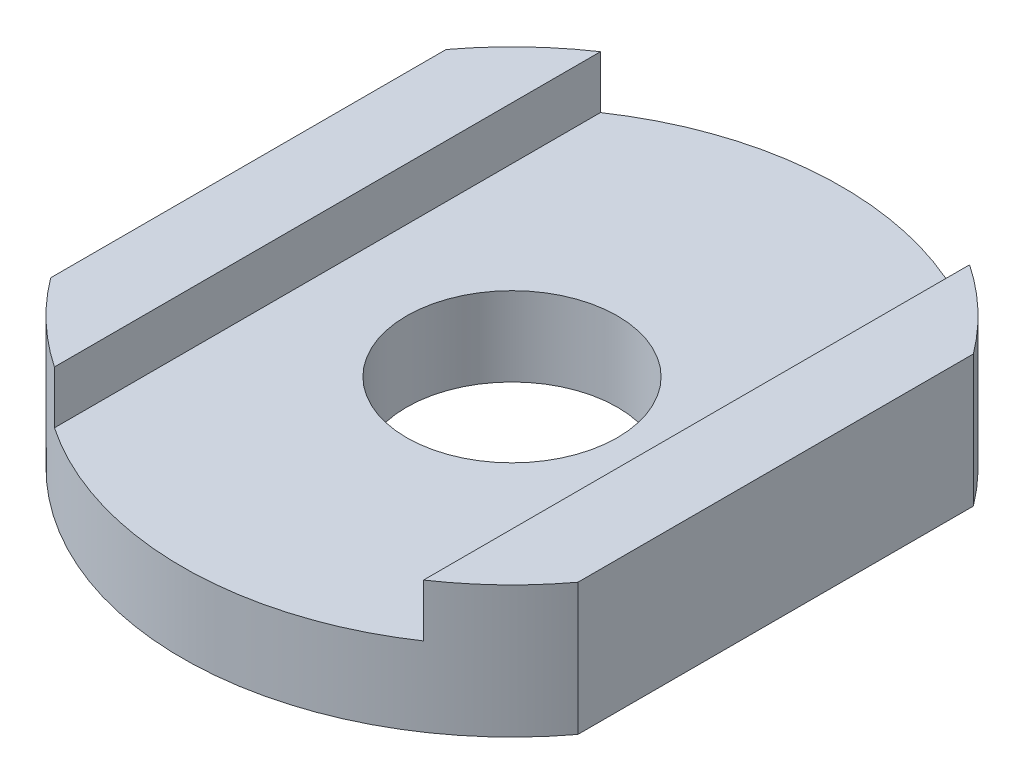
ISO-10303-21;
HEADER;
FILE_DESCRIPTION(('STEP AP214'),'2;1');
FILE_NAME('part.step','',(''),(''),'','','');
FILE_SCHEMA(('AUTOMOTIVE_DESIGN { 1 0 10303 214 1 1 1 1 }'));
ENDSEC;
DATA;
#1=APPLICATION_CONTEXT('core data for automotive mechanical design processes');
#2=APPLICATION_PROTOCOL_DEFINITION('international standard','automotive_design',2000,#1);
#3=PRODUCT_CONTEXT('',#1,'mechanical');
#4=PRODUCT('Part','Part','',(#3));
#5=PRODUCT_RELATED_PRODUCT_CATEGORY('part','',(#4));
#6=PRODUCT_DEFINITION_FORMATION('','',#4);
#7=PRODUCT_DEFINITION_CONTEXT('part definition',#1,'design');
#8=PRODUCT_DEFINITION('design','',#6,#7);
#9=PRODUCT_DEFINITION_SHAPE('','',#8);
#10=(LENGTH_UNIT() NAMED_UNIT(*) SI_UNIT(.MILLI.,.METRE.));
#11=(NAMED_UNIT(*) PLANE_ANGLE_UNIT() SI_UNIT($,.RADIAN.));
#12=(NAMED_UNIT(*) SI_UNIT($,.STERADIAN.) SOLID_ANGLE_UNIT());
#13=UNCERTAINTY_MEASURE_WITH_UNIT(LENGTH_MEASURE(1.E-05),#10,'distance_accuracy_value','');
#14=(GEOMETRIC_REPRESENTATION_CONTEXT(3) GLOBAL_UNCERTAINTY_ASSIGNED_CONTEXT((#13)) GLOBAL_UNIT_ASSIGNED_CONTEXT((#10,
#11,#12)) REPRESENTATION_CONTEXT('',''));
#15=CARTESIAN_POINT('',(0.,0.,0.));
#16=DIRECTION('',(0.,0.,1.));
#17=DIRECTION('',(1.,0.,0.));
#18=AXIS2_PLACEMENT_3D('',#15,#16,#17);
#19=CARTESIAN_POINT('',(0.,3.,0.));
#20=DIRECTION('',(0.,1.,0.));
#21=DIRECTION('',(0.,0.,1.));
#22=AXIS2_PLACEMENT_3D('',#19,#20,#21);
#23=PLANE('',#22);
#24=CARTESIAN_POINT('',(0.,3.,0.));
#25=DIRECTION('',(0.,1.,0.));
#26=DIRECTION('',(0.,0.,1.));
#27=AXIS2_PLACEMENT_3D('',#24,#25,#26);
#28=CIRCLE('',#27,4.);
#29=CARTESIAN_POINT('',(0.,3.,4.));
#30=VERTEX_POINT('',#29);
#31=EDGE_CURVE('E148',#30,#30,#28,.T.);
#32=ORIENTED_EDGE('',*,*,#31,.F.);
#33=EDGE_LOOP('',(#32));
#34=FACE_BOUND('',#33,.T.);
#35=DIRECTION('',(0.,0.,-1.));
#36=VECTOR('',#35,1.);
#37=CARTESIAN_POINT('',(-7.,3.,0.));
#38=LINE('',#37,#36);
#39=CARTESIAN_POINT('',(-7.,3.,10.356157588604));
#40=VERTEX_POINT('',#39);
#41=CARTESIAN_POINT('',(-7.,3.,-10.356157588604));
#42=VERTEX_POINT('',#41);
#43=EDGE_CURVE('E11',#40,#42,#38,.T.);
#44=ORIENTED_EDGE('',*,*,#43,.F.);
#45=CARTESIAN_POINT('',(0.,3.,0.));
#46=DIRECTION('',(0.,1.,0.));
#47=DIRECTION('',(0.,0.,1.));
#48=AXIS2_PLACEMENT_3D('',#45,#46,#47);
#49=CIRCLE('',#48,12.5);
#50=CARTESIAN_POINT('',(7.,3.,10.356157588604));
#51=VERTEX_POINT('',#50);
#52=EDGE_CURVE('E151',#40,#51,#49,.T.);
#53=ORIENTED_EDGE('',*,*,#52,.T.);
#54=DIRECTION('',(0.,0.,-1.));
#55=VECTOR('',#54,1.);
#56=CARTESIAN_POINT('',(7.,3.,0.));
#57=LINE('',#56,#55);
#58=CARTESIAN_POINT('',(7.,3.,-10.356157588604));
#59=VERTEX_POINT('',#58);
#60=EDGE_CURVE('E47',#51,#59,#57,.T.);
#61=ORIENTED_EDGE('',*,*,#60,.T.);
#62=CARTESIAN_POINT('',(0.,3.,0.));
#63=DIRECTION('',(0.,1.,0.));
#64=DIRECTION('',(0.,0.,1.));
#65=AXIS2_PLACEMENT_3D('',#62,#63,#64);
#66=CIRCLE('',#65,12.5);
#67=EDGE_CURVE('E157',#59,#42,#66,.T.);
#68=ORIENTED_EDGE('',*,*,#67,.T.);
#69=EDGE_LOOP('',(#44,#53,#61,#68));
#70=FACE_BOUND('',#69,.T.);
#71=ADVANCED_FACE('F41',(#34,#70),#23,.T.);
#72=CARTESIAN_POINT('',(0.,3.,0.));
#73=DIRECTION('',(0.,-1.,0.));
#74=DIRECTION('',(0.,0.,-1.));
#75=AXIS2_PLACEMENT_3D('',#72,#73,#74);
#76=CYLINDRICAL_SURFACE('',#75,12.5);
#77=DIRECTION('',(0.,-1.,0.));
#78=VECTOR('',#77,1.);
#79=CARTESIAN_POINT('',(10.,3.,7.5));
#80=LINE('',#79,#78);
#81=CARTESIAN_POINT('',(10.,5.,7.5));
#82=VERTEX_POINT('',#81);
#83=CARTESIAN_POINT('',(10.,0.,7.5));
#84=VERTEX_POINT('',#83);
#85=EDGE_CURVE('E174',#82,#84,#80,.T.);
#86=ORIENTED_EDGE('',*,*,#85,.F.);
#87=CARTESIAN_POINT('',(0.,5.,0.));
#88=DIRECTION('',(0.,1.,0.));
#89=DIRECTION('',(0.,0.,1.));
#90=AXIS2_PLACEMENT_3D('',#87,#88,#89);
#91=CIRCLE('',#90,12.5);
#92=CARTESIAN_POINT('',(7.,5.,10.356157588604));
#93=VERTEX_POINT('',#92);
#94=EDGE_CURVE('E144',#93,#82,#91,.T.);
#95=ORIENTED_EDGE('',*,*,#94,.F.);
#96=DIRECTION('',(0.,-1.,0.));
#97=VECTOR('',#96,1.);
#98=CARTESIAN_POINT('',(7.,5.,10.356157588604));
#99=LINE('',#98,#97);
#100=EDGE_CURVE('E135',#93,#51,#99,.T.);
#101=ORIENTED_EDGE('',*,*,#100,.T.);
#102=ORIENTED_EDGE('',*,*,#52,.F.);
#103=DIRECTION('',(0.,-1.,0.));
#104=VECTOR('',#103,1.);
#105=CARTESIAN_POINT('',(-7.,5.,10.356157588604));
#106=LINE('',#105,#104);
#107=CARTESIAN_POINT('',(-7.,5.,10.356157588604));
#108=VERTEX_POINT('',#107);
#109=EDGE_CURVE('E113',#108,#40,#106,.T.);
#110=ORIENTED_EDGE('',*,*,#109,.F.);
#111=CARTESIAN_POINT('',(0.,5.,0.));
#112=DIRECTION('',(0.,1.,0.));
#113=DIRECTION('',(0.,0.,1.));
#114=AXIS2_PLACEMENT_3D('',#111,#112,#113);
#115=CIRCLE('',#114,12.5);
#116=CARTESIAN_POINT('',(-10.,5.,7.5));
#117=VERTEX_POINT('',#116);
#118=EDGE_CURVE('E129',#117,#108,#115,.T.);
#119=ORIENTED_EDGE('',*,*,#118,.F.);
#120=DIRECTION('',(0.,-1.,0.));
#121=VECTOR('',#120,1.);
#122=CARTESIAN_POINT('',(-10.,3.,7.5));
#123=LINE('',#122,#121);
#124=CARTESIAN_POINT('',(-10.,0.,7.5));
#125=VERTEX_POINT('',#124);
#126=EDGE_CURVE('E156',#117,#125,#123,.T.);
#127=ORIENTED_EDGE('',*,*,#126,.T.);
#128=CARTESIAN_POINT('',(0.,0.,0.));
#129=DIRECTION('',(0.,1.,0.));
#130=DIRECTION('',(0.,0.,1.));
#131=AXIS2_PLACEMENT_3D('',#128,#129,#130);
#132=CIRCLE('',#131,12.5);
#133=EDGE_CURVE('E163',#125,#84,#132,.T.);
#134=ORIENTED_EDGE('',*,*,#133,.T.);
#135=EDGE_LOOP('',(#86,#95,#101,#102,#110,#119,#127,#134));
#136=FACE_BOUND('',#135,.T.);
#137=ADVANCED_FACE('F193',(#136),#76,.T.);
#138=CARTESIAN_POINT('',(10.,3.,0.));
#139=DIRECTION('',(-1.,0.,0.));
#140=DIRECTION('',(0.,0.,1.));
#141=AXIS2_PLACEMENT_3D('',#138,#139,#140);
#142=PLANE('',#141);
#143=DIRECTION('',(0.,0.,-1.));
#144=VECTOR('',#143,1.);
#145=CARTESIAN_POINT('',(10.,0.,0.));
#146=LINE('',#145,#144);
#147=CARTESIAN_POINT('',(10.,0.,-7.5));
#148=VERTEX_POINT('',#147);
#149=EDGE_CURVE('E161',#84,#148,#146,.T.);
#150=ORIENTED_EDGE('',*,*,#149,.T.);
#151=DIRECTION('',(0.,-1.,0.));
#152=VECTOR('',#151,1.);
#153=CARTESIAN_POINT('',(10.,3.,-7.5));
#154=LINE('',#153,#152);
#155=CARTESIAN_POINT('',(10.,5.,-7.5));
#156=VERTEX_POINT('',#155);
#157=EDGE_CURVE('E173',#156,#148,#154,.T.);
#158=ORIENTED_EDGE('',*,*,#157,.F.);
#159=DIRECTION('',(0.,0.,-1.));
#160=VECTOR('',#159,1.);
#161=CARTESIAN_POINT('',(10.,5.,0.));
#162=LINE('',#161,#160);
#163=EDGE_CURVE('E138',#82,#156,#162,.T.);
#164=ORIENTED_EDGE('',*,*,#163,.F.);
#165=ORIENTED_EDGE('',*,*,#85,.T.);
#166=EDGE_LOOP('',(#150,#158,#164,#165));
#167=FACE_BOUND('',#166,.T.);
#168=ADVANCED_FACE('F182',(#167),#142,.F.);
#169=CARTESIAN_POINT('',(0.,3.,0.));
#170=DIRECTION('',(0.,-1.,0.));
#171=DIRECTION('',(0.,0.,-1.));
#172=AXIS2_PLACEMENT_3D('',#169,#170,#171);
#173=CYLINDRICAL_SURFACE('',#172,12.5);
#174=DIRECTION('',(0.,-1.,0.));
#175=VECTOR('',#174,1.);
#176=CARTESIAN_POINT('',(-10.,3.,-7.5));
#177=LINE('',#176,#175);
#178=CARTESIAN_POINT('',(-10.,5.,-7.5));
#179=VERTEX_POINT('',#178);
#180=CARTESIAN_POINT('',(-10.,0.,-7.5));
#181=VERTEX_POINT('',#180);
#182=EDGE_CURVE('E123',#179,#181,#177,.T.);
#183=ORIENTED_EDGE('',*,*,#182,.F.);
#184=CARTESIAN_POINT('',(0.,5.,0.));
#185=DIRECTION('',(0.,1.,0.));
#186=DIRECTION('',(0.,0.,1.));
#187=AXIS2_PLACEMENT_3D('',#184,#185,#186);
#188=CIRCLE('',#187,12.5);
#189=CARTESIAN_POINT('',(-7.,5.,-10.356157588604));
#190=VERTEX_POINT('',#189);
#191=EDGE_CURVE('E116',#190,#179,#188,.T.);
#192=ORIENTED_EDGE('',*,*,#191,.F.);
#193=DIRECTION('',(0.,-1.,0.));
#194=VECTOR('',#193,1.);
#195=CARTESIAN_POINT('',(-7.,5.,-10.356157588604));
#196=LINE('',#195,#194);
#197=EDGE_CURVE('E108',#190,#42,#196,.T.);
#198=ORIENTED_EDGE('',*,*,#197,.T.);
#199=ORIENTED_EDGE('',*,*,#67,.F.);
#200=DIRECTION('',(0.,-1.,0.));
#201=VECTOR('',#200,1.);
#202=CARTESIAN_POINT('',(7.,5.,-10.356157588604));
#203=LINE('',#202,#201);
#204=CARTESIAN_POINT('',(7.,5.,-10.356157588604));
#205=VERTEX_POINT('',#204);
#206=EDGE_CURVE('E57',#205,#59,#203,.T.);
#207=ORIENTED_EDGE('',*,*,#206,.F.);
#208=CARTESIAN_POINT('',(0.,5.,0.));
#209=DIRECTION('',(0.,1.,0.));
#210=DIRECTION('',(0.,0.,1.));
#211=AXIS2_PLACEMENT_3D('',#208,#209,#210);
#212=CIRCLE('',#211,12.5);
#213=EDGE_CURVE('E141',#156,#205,#212,.T.);
#214=ORIENTED_EDGE('',*,*,#213,.F.);
#215=ORIENTED_EDGE('',*,*,#157,.T.);
#216=CARTESIAN_POINT('',(0.,0.,0.));
#217=DIRECTION('',(0.,1.,0.));
#218=DIRECTION('',(0.,0.,1.));
#219=AXIS2_PLACEMENT_3D('',#216,#217,#218);
#220=CIRCLE('',#219,12.5);
#221=EDGE_CURVE('E164',#148,#181,#220,.T.);
#222=ORIENTED_EDGE('',*,*,#221,.T.);
#223=EDGE_LOOP('',(#183,#192,#198,#199,#207,#214,#215,#222));
#224=FACE_BOUND('',#223,.T.);
#225=ADVANCED_FACE('F117',(#224),#173,.T.);
#226=CARTESIAN_POINT('',(0.,3.,0.));
#227=DIRECTION('',(0.,-1.,0.));
#228=DIRECTION('',(0.,0.,-1.));
#229=AXIS2_PLACEMENT_3D('',#226,#227,#228);
#230=CYLINDRICAL_SURFACE('',#229,4.);
#231=ORIENTED_EDGE('',*,*,#31,.T.);
#232=EDGE_LOOP('',(#231));
#233=FACE_BOUND('',#232,.T.);
#234=CARTESIAN_POINT('',(0.,0.,0.));
#235=DIRECTION('',(0.,1.,0.));
#236=DIRECTION('',(0.,0.,1.));
#237=AXIS2_PLACEMENT_3D('',#234,#235,#236);
#238=CIRCLE('',#237,4.);
#239=CARTESIAN_POINT('',(0.,0.,4.));
#240=VERTEX_POINT('',#239);
#241=EDGE_CURVE('E114',#240,#240,#238,.T.);
#242=ORIENTED_EDGE('',*,*,#241,.F.);
#243=EDGE_LOOP('',(#242));
#244=FACE_BOUND('',#243,.T.);
#245=ADVANCED_FACE('F43',(#233,#244),#230,.F.);
#246=CARTESIAN_POINT('',(-10.,3.,0.));
#247=DIRECTION('',(-1.,0.,0.));
#248=DIRECTION('',(0.,0.,1.));
#249=AXIS2_PLACEMENT_3D('',#246,#247,#248);
#250=PLANE('',#249);
#251=DIRECTION('',(0.,0.,-1.));
#252=VECTOR('',#251,1.);
#253=CARTESIAN_POINT('',(-10.,0.,0.));
#254=LINE('',#253,#252);
#255=EDGE_CURVE('E152',#125,#181,#254,.T.);
#256=ORIENTED_EDGE('',*,*,#255,.F.);
#257=ORIENTED_EDGE('',*,*,#126,.F.);
#258=DIRECTION('',(0.,0.,-1.));
#259=VECTOR('',#258,1.);
#260=CARTESIAN_POINT('',(-10.,5.,0.));
#261=LINE('',#260,#259);
#262=EDGE_CURVE('E124',#117,#179,#261,.T.);
#263=ORIENTED_EDGE('',*,*,#262,.T.);
#264=ORIENTED_EDGE('',*,*,#182,.T.);
#265=EDGE_LOOP('',(#256,#257,#263,#264));
#266=FACE_BOUND('',#265,.T.);
#267=ADVANCED_FACE('F194',(#266),#250,.T.);
#268=CARTESIAN_POINT('',(0.,0.,0.));
#269=DIRECTION('',(0.,1.,0.));
#270=DIRECTION('',(0.,0.,1.));
#271=AXIS2_PLACEMENT_3D('',#268,#269,#270);
#272=PLANE('',#271);
#273=ORIENTED_EDGE('',*,*,#149,.F.);
#274=ORIENTED_EDGE('',*,*,#133,.F.);
#275=ORIENTED_EDGE('',*,*,#255,.T.);
#276=ORIENTED_EDGE('',*,*,#221,.F.);
#277=EDGE_LOOP('',(#273,#274,#275,#276));
#278=FACE_BOUND('',#277,.T.);
#279=ORIENTED_EDGE('',*,*,#241,.T.);
#280=EDGE_LOOP('',(#279));
#281=FACE_BOUND('',#280,.T.);
#282=ADVANCED_FACE('F187',(#278,#281),#272,.F.);
#283=CARTESIAN_POINT('',(7.,5.,0.));
#284=DIRECTION('',(1.,0.,0.));
#285=DIRECTION('',(0.,0.,-1.));
#286=AXIS2_PLACEMENT_3D('',#283,#284,#285);
#287=PLANE('',#286);
#288=ORIENTED_EDGE('',*,*,#60,.F.);
#289=ORIENTED_EDGE('',*,*,#100,.F.);
#290=DIRECTION('',(0.,0.,1.));
#291=VECTOR('',#290,1.);
#292=CARTESIAN_POINT('',(7.,5.,0.));
#293=LINE('',#292,#291);
#294=EDGE_CURVE('E142',#205,#93,#293,.T.);
#295=ORIENTED_EDGE('',*,*,#294,.F.);
#296=ORIENTED_EDGE('',*,*,#206,.T.);
#297=EDGE_LOOP('',(#288,#289,#295,#296));
#298=FACE_BOUND('',#297,.T.);
#299=ADVANCED_FACE('F178',(#298),#287,.F.);
#300=CARTESIAN_POINT('',(0.,5.,0.));
#301=DIRECTION('',(0.,1.,0.));
#302=DIRECTION('',(0.,0.,1.));
#303=AXIS2_PLACEMENT_3D('',#300,#301,#302);
#304=PLANE('',#303);
#305=ORIENTED_EDGE('',*,*,#163,.T.);
#306=ORIENTED_EDGE('',*,*,#213,.T.);
#307=ORIENTED_EDGE('',*,*,#294,.T.);
#308=ORIENTED_EDGE('',*,*,#94,.T.);
#309=EDGE_LOOP('',(#305,#306,#307,#308));
#310=FACE_BOUND('',#309,.T.);
#311=ADVANCED_FACE('F181',(#310),#304,.T.);
#312=CARTESIAN_POINT('',(-7.,5.,0.));
#313=DIRECTION('',(1.,0.,0.));
#314=DIRECTION('',(0.,0.,-1.));
#315=AXIS2_PLACEMENT_3D('',#312,#313,#314);
#316=PLANE('',#315);
#317=ORIENTED_EDGE('',*,*,#109,.T.);
#318=ORIENTED_EDGE('',*,*,#43,.T.);
#319=ORIENTED_EDGE('',*,*,#197,.F.);
#320=DIRECTION('',(0.,0.,1.));
#321=VECTOR('',#320,1.);
#322=CARTESIAN_POINT('',(-7.,5.,0.));
#323=LINE('',#322,#321);
#324=EDGE_CURVE('E112',#190,#108,#323,.T.);
#325=ORIENTED_EDGE('',*,*,#324,.T.);
#326=EDGE_LOOP('',(#317,#318,#319,#325));
#327=FACE_BOUND('',#326,.T.);
#328=ADVANCED_FACE('F107',(#327),#316,.T.);
#329=CARTESIAN_POINT('',(0.,5.,0.));
#330=DIRECTION('',(0.,1.,0.));
#331=DIRECTION('',(0.,0.,1.));
#332=AXIS2_PLACEMENT_3D('',#329,#330,#331);
#333=PLANE('',#332);
#334=ORIENTED_EDGE('',*,*,#324,.F.);
#335=ORIENTED_EDGE('',*,*,#191,.T.);
#336=ORIENTED_EDGE('',*,*,#262,.F.);
#337=ORIENTED_EDGE('',*,*,#118,.T.);
#338=EDGE_LOOP('',(#334,#335,#336,#337));
#339=FACE_BOUND('',#338,.T.);
#340=ADVANCED_FACE('F130',(#339),#333,.T.);
#341=CLOSED_SHELL('',(#71,#137,#168,#225,#245,#267,#282,#299,#311,#328,#340));
#342=MANIFOLD_SOLID_BREP('B2',#341);
#343=ADVANCED_BREP_SHAPE_REPRESENTATION('',(#18,#342),#14);
#344=SHAPE_DEFINITION_REPRESENTATION(#9,#343);
ENDSEC;
END-ISO-10303-21;
